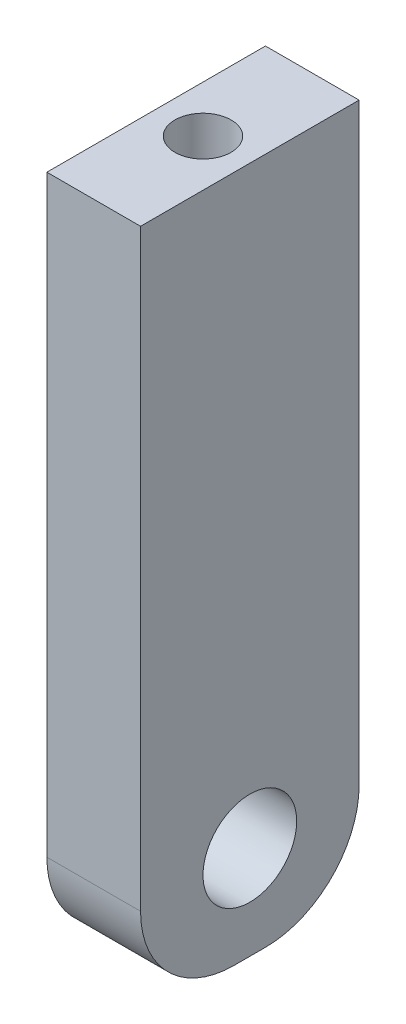
ISO-10303-21;
HEADER;
FILE_DESCRIPTION(('STEP AP214'),'2;1');
FILE_NAME('part.step','',(''),(''),'','','');
FILE_SCHEMA(('AUTOMOTIVE_DESIGN { 1 0 10303 214 1 1 1 1 }'));
ENDSEC;
DATA;
#1=APPLICATION_CONTEXT('core data for automotive mechanical design processes');
#2=APPLICATION_PROTOCOL_DEFINITION('international standard','automotive_design',2000,#1);
#3=PRODUCT_CONTEXT('',#1,'mechanical');
#4=PRODUCT('Part','Part','',(#3));
#5=PRODUCT_RELATED_PRODUCT_CATEGORY('part','',(#4));
#6=PRODUCT_DEFINITION_FORMATION('','',#4);
#7=PRODUCT_DEFINITION_CONTEXT('part definition',#1,'design');
#8=PRODUCT_DEFINITION('design','',#6,#7);
#9=PRODUCT_DEFINITION_SHAPE('','',#8);
#10=(LENGTH_UNIT() NAMED_UNIT(*) SI_UNIT(.MILLI.,.METRE.));
#11=(NAMED_UNIT(*) PLANE_ANGLE_UNIT() SI_UNIT($,.RADIAN.));
#12=(NAMED_UNIT(*) SI_UNIT($,.STERADIAN.) SOLID_ANGLE_UNIT());
#13=UNCERTAINTY_MEASURE_WITH_UNIT(LENGTH_MEASURE(1.E-05),#10,'distance_accuracy_value','');
#14=(GEOMETRIC_REPRESENTATION_CONTEXT(3) GLOBAL_UNCERTAINTY_ASSIGNED_CONTEXT((#13)) GLOBAL_UNIT_ASSIGNED_CONTEXT((#10,
#11,#12)) REPRESENTATION_CONTEXT('',''));
#15=CARTESIAN_POINT('',(0.,0.,0.));
#16=DIRECTION('',(0.,0.,1.));
#17=DIRECTION('',(1.,0.,0.));
#18=AXIS2_PLACEMENT_3D('',#15,#16,#17);
#19=CARTESIAN_POINT('',(3.,0.546254549383258,7.));
#20=DIRECTION('',(0.,-1.,0.));
#21=DIRECTION('',(1.,0.,0.));
#22=AXIS2_PLACEMENT_3D('',#19,#20,#21);
#23=PLANE('',#22);
#24=CARTESIAN_POINT('',(1.5,0.546254549383257,3.5));
#25=DIRECTION('',(0.,1.,0.));
#26=DIRECTION('',(-1.,0.,0.));
#27=AXIS2_PLACEMENT_3D('',#24,#25,#26);
#28=CIRCLE('',#27,0.9);
#29=CARTESIAN_POINT('',(0.6,0.546254549383257,3.5));
#30=VERTEX_POINT('',#29);
#31=EDGE_CURVE('E193',#30,#30,#28,.T.);
#32=ORIENTED_EDGE('',*,*,#31,.F.);
#33=EDGE_LOOP('',(#32));
#34=FACE_BOUND('',#33,.T.);
#35=DIRECTION('',(-1.,0.,0.));
#36=VECTOR('',#35,1.);
#37=CARTESIAN_POINT('',(3.,0.546254549383258,0.));
#38=LINE('',#37,#36);
#39=CARTESIAN_POINT('',(3.,0.546254549383258,0.));
#40=VERTEX_POINT('',#39);
#41=CARTESIAN_POINT('',(0.,0.546254549383257,0.));
#42=VERTEX_POINT('',#41);
#43=EDGE_CURVE('E115',#40,#42,#38,.T.);
#44=ORIENTED_EDGE('',*,*,#43,.T.);
#45=DIRECTION('',(0.,0.,-1.));
#46=VECTOR('',#45,1.);
#47=CARTESIAN_POINT('',(0.,0.546254549383257,7.));
#48=LINE('',#47,#46);
#49=CARTESIAN_POINT('',(0.,0.546254549383257,7.));
#50=VERTEX_POINT('',#49);
#51=EDGE_CURVE('E97',#50,#42,#48,.T.);
#52=ORIENTED_EDGE('',*,*,#51,.F.);
#53=DIRECTION('',(-1.,0.,0.));
#54=VECTOR('',#53,1.);
#55=CARTESIAN_POINT('',(3.,0.546254549383258,7.));
#56=LINE('',#55,#54);
#57=CARTESIAN_POINT('',(3.,0.546254549383258,7.));
#58=VERTEX_POINT('',#57);
#59=EDGE_CURVE('E104',#58,#50,#56,.T.);
#60=ORIENTED_EDGE('',*,*,#59,.F.);
#61=DIRECTION('',(0.,0.,-1.));
#62=VECTOR('',#61,1.);
#63=CARTESIAN_POINT('',(3.,0.546254549383258,7.));
#64=LINE('',#63,#62);
#65=EDGE_CURVE('E143',#58,#40,#64,.T.);
#66=ORIENTED_EDGE('',*,*,#65,.T.);
#67=EDGE_LOOP('',(#44,#52,#60,#66));
#68=FACE_BOUND('',#67,.T.);
#69=ADVANCED_FACE('F41',(#34,#68),#23,.F.);
#70=CARTESIAN_POINT('',(0.,0.546254549383257,7.));
#71=DIRECTION('',(1.,0.,0.));
#72=DIRECTION('',(0.,1.,0.));
#73=AXIS2_PLACEMENT_3D('',#70,#71,#72);
#74=PLANE('',#73);
#75=CARTESIAN_POINT('',(0.,-18.4537454506167,3.5));
#76=DIRECTION('',(1.,0.,0.));
#77=DIRECTION('',(0.,0.,-1.));
#78=AXIS2_PLACEMENT_3D('',#75,#76,#77);
#79=CIRCLE('',#78,1.5);
#80=CARTESIAN_POINT('',(0.,-18.4537454506167,2.));
#81=VERTEX_POINT('',#80);
#82=EDGE_CURVE('E149',#81,#81,#79,.T.);
#83=ORIENTED_EDGE('',*,*,#82,.T.);
#84=EDGE_LOOP('',(#83));
#85=FACE_BOUND('',#84,.T.);
#86=DIRECTION('',(0.,0.,-1.));
#87=VECTOR('',#86,1.);
#88=CARTESIAN_POINT('',(0.,-21.4537454506167,7.));
#89=LINE('',#88,#87);
#90=CARTESIAN_POINT('',(0.,-21.4537454506167,4.));
#91=VERTEX_POINT('',#90);
#92=CARTESIAN_POINT('',(0.,-21.4537454506167,3.));
#93=VERTEX_POINT('',#92);
#94=EDGE_CURVE('E117',#91,#93,#89,.T.);
#95=ORIENTED_EDGE('',*,*,#94,.F.);
#96=CARTESIAN_POINT('',(0.,-18.4537454506167,4.));
#97=DIRECTION('',(1.,0.,0.));
#98=DIRECTION('',(0.,1.,0.));
#99=AXIS2_PLACEMENT_3D('',#96,#97,#98);
#100=CIRCLE('',#99,3.);
#101=CARTESIAN_POINT('',(0.,-18.4537454506167,7.));
#102=VERTEX_POINT('',#101);
#103=EDGE_CURVE('E49',#91,#102,#100,.F.);
#104=ORIENTED_EDGE('',*,*,#103,.T.);
#105=DIRECTION('',(0.,-1.,0.));
#106=VECTOR('',#105,1.);
#107=CARTESIAN_POINT('',(0.,0.546254549383257,7.));
#108=LINE('',#107,#106);
#109=EDGE_CURVE('E93',#50,#102,#108,.T.);
#110=ORIENTED_EDGE('',*,*,#109,.F.);
#111=ORIENTED_EDGE('',*,*,#51,.T.);
#112=DIRECTION('',(0.,-1.,0.));
#113=VECTOR('',#112,1.);
#114=CARTESIAN_POINT('',(0.,0.546254549383257,0.));
#115=LINE('',#114,#113);
#116=CARTESIAN_POINT('',(0.,-18.4537454506167,0.));
#117=VERTEX_POINT('',#116);
#118=EDGE_CURVE('E148',#42,#117,#115,.T.);
#119=ORIENTED_EDGE('',*,*,#118,.T.);
#120=CARTESIAN_POINT('',(0.,-18.4537454506167,3.));
#121=DIRECTION('',(1.,0.,0.));
#122=DIRECTION('',(0.,1.,0.));
#123=AXIS2_PLACEMENT_3D('',#120,#121,#122);
#124=CIRCLE('',#123,3.);
#125=EDGE_CURVE('E61',#117,#93,#124,.F.);
#126=ORIENTED_EDGE('',*,*,#125,.T.);
#127=EDGE_LOOP('',(#95,#104,#110,#111,#119,#126));
#128=FACE_BOUND('',#127,.T.);
#129=ADVANCED_FACE('F95',(#85,#128),#74,.F.);
#130=CARTESIAN_POINT('',(0.,-21.4537454506167,7.));
#131=DIRECTION('',(0.,1.,0.));
#132=DIRECTION('',(0.,0.,1.));
#133=AXIS2_PLACEMENT_3D('',#130,#131,#132);
#134=PLANE('',#133);
#135=DIRECTION('',(0.,0.,-1.));
#136=VECTOR('',#135,1.);
#137=CARTESIAN_POINT('',(3.,-21.4537454506167,7.));
#138=LINE('',#137,#136);
#139=CARTESIAN_POINT('',(3.,-21.4537454506167,4.));
#140=VERTEX_POINT('',#139);
#141=CARTESIAN_POINT('',(3.,-21.4537454506167,3.));
#142=VERTEX_POINT('',#141);
#143=EDGE_CURVE('E121',#140,#142,#138,.T.);
#144=ORIENTED_EDGE('',*,*,#143,.F.);
#145=DIRECTION('',(1.,0.,0.));
#146=VECTOR('',#145,1.);
#147=CARTESIAN_POINT('',(0.,-21.4537454506167,4.));
#148=LINE('',#147,#146);
#149=EDGE_CURVE('E131',#140,#91,#148,.F.);
#150=ORIENTED_EDGE('',*,*,#149,.T.);
#151=ORIENTED_EDGE('',*,*,#94,.T.);
#152=DIRECTION('',(1.,0.,0.));
#153=VECTOR('',#152,1.);
#154=CARTESIAN_POINT('',(0.,-21.4537454506167,3.));
#155=LINE('',#154,#153);
#156=EDGE_CURVE('E128',#93,#142,#155,.T.);
#157=ORIENTED_EDGE('',*,*,#156,.T.);
#158=EDGE_LOOP('',(#144,#150,#151,#157));
#159=FACE_BOUND('',#158,.T.);
#160=ADVANCED_FACE('F136',(#159),#134,.F.);
#161=CARTESIAN_POINT('',(3.,-21.4537454506167,7.));
#162=DIRECTION('',(-1.,0.,0.));
#163=DIRECTION('',(0.,0.,1.));
#164=AXIS2_PLACEMENT_3D('',#161,#162,#163);
#165=PLANE('',#164);
#166=CARTESIAN_POINT('',(3.,-18.4537454506167,3.5));
#167=DIRECTION('',(1.,0.,0.));
#168=DIRECTION('',(0.,0.,-1.));
#169=AXIS2_PLACEMENT_3D('',#166,#167,#168);
#170=CIRCLE('',#169,1.5);
#171=CARTESIAN_POINT('',(3.,-18.4537454506167,2.));
#172=VERTEX_POINT('',#171);
#173=EDGE_CURVE('E192',#172,#172,#170,.T.);
#174=ORIENTED_EDGE('',*,*,#173,.F.);
#175=EDGE_LOOP('',(#174));
#176=FACE_BOUND('',#175,.T.);
#177=DIRECTION('',(0.,1.,0.));
#178=VECTOR('',#177,1.);
#179=CARTESIAN_POINT('',(3.,-21.4537454506167,7.));
#180=LINE('',#179,#178);
#181=CARTESIAN_POINT('',(3.,-18.4537454506167,7.));
#182=VERTEX_POINT('',#181);
#183=EDGE_CURVE('E103',#182,#58,#180,.T.);
#184=ORIENTED_EDGE('',*,*,#183,.F.);
#185=CARTESIAN_POINT('',(3.,-18.4537454506167,4.));
#186=DIRECTION('',(-1.,0.,0.));
#187=DIRECTION('',(0.,0.,1.));
#188=AXIS2_PLACEMENT_3D('',#185,#186,#187);
#189=CIRCLE('',#188,3.);
#190=EDGE_CURVE('E126',#182,#140,#189,.F.);
#191=ORIENTED_EDGE('',*,*,#190,.T.);
#192=ORIENTED_EDGE('',*,*,#143,.T.);
#193=CARTESIAN_POINT('',(3.,-18.4537454506167,3.));
#194=DIRECTION('',(-1.,0.,0.));
#195=DIRECTION('',(0.,0.,1.));
#196=AXIS2_PLACEMENT_3D('',#193,#194,#195);
#197=CIRCLE('',#196,3.);
#198=CARTESIAN_POINT('',(3.,-18.4537454506167,0.));
#199=VERTEX_POINT('',#198);
#200=EDGE_CURVE('E119',#142,#199,#197,.F.);
#201=ORIENTED_EDGE('',*,*,#200,.T.);
#202=DIRECTION('',(0.,1.,0.));
#203=VECTOR('',#202,1.);
#204=CARTESIAN_POINT('',(3.,-21.4537454506167,0.));
#205=LINE('',#204,#203);
#206=EDGE_CURVE('E112',#199,#40,#205,.T.);
#207=ORIENTED_EDGE('',*,*,#206,.T.);
#208=ORIENTED_EDGE('',*,*,#65,.F.);
#209=EDGE_LOOP('',(#184,#191,#192,#201,#207,#208));
#210=FACE_BOUND('',#209,.T.);
#211=ADVANCED_FACE('F142',(#176,#210),#165,.F.);
#212=CARTESIAN_POINT('',(0.,0.,7.));
#213=DIRECTION('',(0.,0.,1.));
#214=DIRECTION('',(1.,0.,0.));
#215=AXIS2_PLACEMENT_3D('',#212,#213,#214);
#216=PLANE('',#215);
#217=ORIENTED_EDGE('',*,*,#109,.T.);
#218=DIRECTION('',(1.,0.,0.));
#219=VECTOR('',#218,1.);
#220=CARTESIAN_POINT('',(3.,-18.4537454506167,7.));
#221=LINE('',#220,#219);
#222=EDGE_CURVE('E116',#102,#182,#221,.T.);
#223=ORIENTED_EDGE('',*,*,#222,.T.);
#224=ORIENTED_EDGE('',*,*,#183,.T.);
#225=ORIENTED_EDGE('',*,*,#59,.T.);
#226=EDGE_LOOP('',(#217,#223,#224,#225));
#227=FACE_BOUND('',#226,.T.);
#228=ADVANCED_FACE('F107',(#227),#216,.T.);
#229=CARTESIAN_POINT('',(0.,0.,0.));
#230=DIRECTION('',(0.,0.,1.));
#231=DIRECTION('',(1.,0.,0.));
#232=AXIS2_PLACEMENT_3D('',#229,#230,#231);
#233=PLANE('',#232);
#234=ORIENTED_EDGE('',*,*,#206,.F.);
#235=DIRECTION('',(1.,0.,0.));
#236=VECTOR('',#235,1.);
#237=CARTESIAN_POINT('',(0.,-18.4537454506167,0.));
#238=LINE('',#237,#236);
#239=EDGE_CURVE('E11',#199,#117,#238,.F.);
#240=ORIENTED_EDGE('',*,*,#239,.T.);
#241=ORIENTED_EDGE('',*,*,#118,.F.);
#242=ORIENTED_EDGE('',*,*,#43,.F.);
#243=EDGE_LOOP('',(#234,#240,#241,#242));
#244=FACE_BOUND('',#243,.T.);
#245=ADVANCED_FACE('F152',(#244),#233,.F.);
#246=CARTESIAN_POINT('',(0.,-18.4537454506167,3.5));
#247=DIRECTION('',(1.,0.,0.));
#248=DIRECTION('',(0.,0.,-1.));
#249=AXIS2_PLACEMENT_3D('',#246,#247,#248);
#250=CYLINDRICAL_SURFACE('',#249,1.5);
#251=CARTESIAN_POINT('',(0.,-18.4537454506167,2.));
#252=CARTESIAN_POINT('',(0.0312499999999995,-18.4537454506167,2.));
#253=CARTESIAN_POINT('',(0.0624999999999996,-18.4537454506167,2.));
#254=CARTESIAN_POINT('',(0.125,-18.4537454506167,2.));
#255=CARTESIAN_POINT('',(0.15625,-18.4537454506167,2.));
#256=CARTESIAN_POINT('',(0.21875,-18.4537454506167,2.));
#257=CARTESIAN_POINT('',(0.25,-18.4537454506167,2.));
#258=CARTESIAN_POINT('',(0.3125,-18.4537454506167,2.));
#259=CARTESIAN_POINT('',(0.34375,-18.4537454506167,2.));
#260=CARTESIAN_POINT('',(0.40625,-18.4537454506167,2.));
#261=CARTESIAN_POINT('',(0.4375,-18.4537454506167,2.));
#262=CARTESIAN_POINT('',(0.5,-18.4537454506167,2.));
#263=CARTESIAN_POINT('',(0.53125,-18.4537454506167,2.));
#264=CARTESIAN_POINT('',(0.59375,-18.4537454506167,2.));
#265=CARTESIAN_POINT('',(0.625,-18.4537454506167,2.));
#266=CARTESIAN_POINT('',(0.6875,-18.4537454506167,2.));
#267=CARTESIAN_POINT('',(0.71875,-18.4537454506167,2.));
#268=CARTESIAN_POINT('',(0.78125,-18.4537454506167,2.));
#269=CARTESIAN_POINT('',(0.8125,-18.4537454506167,2.));
#270=CARTESIAN_POINT('',(0.875,-18.4537454506167,2.));
#271=CARTESIAN_POINT('',(0.90625,-18.4537454506167,2.));
#272=CARTESIAN_POINT('',(0.96875,-18.4537454506167,2.));
#273=CARTESIAN_POINT('',(1.,-18.4537454506167,2.));
#274=CARTESIAN_POINT('',(1.0625,-18.4537454506167,2.));
#275=CARTESIAN_POINT('',(1.09375,-18.4537454506167,2.));
#276=CARTESIAN_POINT('',(1.15625,-18.4537454506167,2.));
#277=CARTESIAN_POINT('',(1.1875,-18.4537454506167,2.));
#278=CARTESIAN_POINT('',(1.25,-18.4537454506167,2.));
#279=CARTESIAN_POINT('',(1.28125,-18.4537454506167,2.));
#280=CARTESIAN_POINT('',(1.34375,-18.4537454506167,2.));
#281=CARTESIAN_POINT('',(1.375,-18.4537454506167,2.));
#282=CARTESIAN_POINT('',(1.4375,-18.4537454506167,2.));
#283=CARTESIAN_POINT('',(1.46875,-18.4537454506167,2.));
#284=CARTESIAN_POINT('',(1.53125,-18.4537454506167,2.));
#285=CARTESIAN_POINT('',(1.5625,-18.4537454506167,2.));
#286=CARTESIAN_POINT('',(1.625,-18.4537454506167,2.));
#287=CARTESIAN_POINT('',(1.65625,-18.4537454506167,2.));
#288=CARTESIAN_POINT('',(1.71875,-18.4537454506167,2.));
#289=CARTESIAN_POINT('',(1.75,-18.4537454506167,2.));
#290=CARTESIAN_POINT('',(1.8125,-18.4537454506167,2.));
#291=CARTESIAN_POINT('',(1.84375,-18.4537454506167,2.));
#292=CARTESIAN_POINT('',(1.90625,-18.4537454506167,2.));
#293=CARTESIAN_POINT('',(1.9375,-18.4537454506167,2.));
#294=CARTESIAN_POINT('',(2.,-18.4537454506167,2.));
#295=CARTESIAN_POINT('',(2.03125,-18.4537454506167,2.));
#296=CARTESIAN_POINT('',(2.09375,-18.4537454506167,2.));
#297=CARTESIAN_POINT('',(2.125,-18.4537454506167,2.));
#298=CARTESIAN_POINT('',(2.1875,-18.4537454506167,2.));
#299=CARTESIAN_POINT('',(2.21875,-18.4537454506167,2.));
#300=CARTESIAN_POINT('',(2.28125,-18.4537454506167,2.));
#301=CARTESIAN_POINT('',(2.3125,-18.4537454506167,2.));
#302=CARTESIAN_POINT('',(2.375,-18.4537454506167,2.));
#303=CARTESIAN_POINT('',(2.40625,-18.4537454506167,2.));
#304=CARTESIAN_POINT('',(2.46875,-18.4537454506167,2.));
#305=CARTESIAN_POINT('',(2.5,-18.4537454506167,2.));
#306=CARTESIAN_POINT('',(2.5625,-18.4537454506167,2.));
#307=CARTESIAN_POINT('',(2.59375,-18.4537454506167,2.));
#308=CARTESIAN_POINT('',(2.65625,-18.4537454506167,2.));
#309=CARTESIAN_POINT('',(2.6875,-18.4537454506167,2.));
#310=CARTESIAN_POINT('',(2.75,-18.4537454506167,2.));
#311=CARTESIAN_POINT('',(2.78125,-18.4537454506167,2.));
#312=CARTESIAN_POINT('',(2.84375,-18.4537454506167,2.));
#313=CARTESIAN_POINT('',(2.875,-18.4537454506167,2.));
#314=CARTESIAN_POINT('',(2.9375,-18.4537454506167,2.));
#315=CARTESIAN_POINT('',(2.96875,-18.4537454506167,2.));
#316=CARTESIAN_POINT('',(3.,-18.4537454506167,2.));
#317=B_SPLINE_CURVE_WITH_KNOTS('',3,(#251,#252,#253,#254,#255,#256,#257,#258,#259,#260,#261,
#262,#263,#264,#265,#266,#267,#268,#269,#270,#271,#272,#273,#274,#275,#276,#277,#278,#279,#280,
#281,#282,#283,#284,#285,#286,#287,#288,#289,#290,#291,#292,#293,#294,#295,#296,#297,#298,#299,
#300,#301,#302,#303,#304,#305,#306,#307,#308,#309,#310,#311,#312,#313,#314,#315,#316),
.UNSPECIFIED.,.F.,.F.,(4,2,2,2,2,2,2,2,2,2,2,2,2,2,2,2,2,2,2,2,2,2,2,2,2,2,2,2,2,2,2,2,4),(0.,
0.09375,0.1875,0.28125,0.375,0.46875,0.5625,0.65625,0.75,0.84375,0.9375,1.03125,1.125,1.21875,
1.3125,1.40625,1.5,1.59375,1.6875,1.78125,1.875,1.96875,2.0625,2.15625,2.25,2.34375,2.4375,
2.53125,2.625,2.71875,2.8125,2.90625,3.),.UNSPECIFIED.);
#318=EDGE_CURVE('BSEAM163',#81,#172,#317,.T.);
#319=ORIENTED_EDGE('',*,*,#82,.F.);
#320=ORIENTED_EDGE('',*,*,#173,.T.);
#321=ORIENTED_EDGE('',*,*,#318,.T.);
#322=ORIENTED_EDGE('',*,*,#318,.F.);
#323=EDGE_LOOP('',(#319,#321,#320,#322));
#324=FACE_BOUND('',#323,.T.);
#325=ADVANCED_FACE('F163',(#324),#250,.F.);
#326=CARTESIAN_POINT('',(0.,-18.4537454506167,4.));
#327=DIRECTION('',(-1.,0.,0.));
#328=DIRECTION('',(0.,0.,1.));
#329=AXIS2_PLACEMENT_3D('',#326,#327,#328);
#330=CYLINDRICAL_SURFACE('',#329,3.);
#331=ORIENTED_EDGE('',*,*,#103,.F.);
#332=ORIENTED_EDGE('',*,*,#149,.F.);
#333=ORIENTED_EDGE('',*,*,#190,.F.);
#334=ORIENTED_EDGE('',*,*,#222,.F.);
#335=EDGE_LOOP('',(#331,#332,#333,#334));
#336=FACE_BOUND('',#335,.T.);
#337=ADVANCED_FACE('F140',(#336),#330,.T.);
#338=CARTESIAN_POINT('',(0.,-18.4537454506167,3.));
#339=DIRECTION('',(1.,0.,0.));
#340=DIRECTION('',(0.,0.,-1.));
#341=AXIS2_PLACEMENT_3D('',#338,#339,#340);
#342=CYLINDRICAL_SURFACE('',#341,3.);
#343=ORIENTED_EDGE('',*,*,#125,.F.);
#344=ORIENTED_EDGE('',*,*,#239,.F.);
#345=ORIENTED_EDGE('',*,*,#200,.F.);
#346=ORIENTED_EDGE('',*,*,#156,.F.);
#347=EDGE_LOOP('',(#343,#344,#345,#346));
#348=FACE_BOUND('',#347,.T.);
#349=ADVANCED_FACE('F43',(#348),#342,.T.);
#350=CARTESIAN_POINT('',(1.5,-6.45374545061674,3.5));
#351=DIRECTION('',(0.,1.,0.));
#352=DIRECTION('',(-1.,0.,0.));
#353=AXIS2_PLACEMENT_3D('',#350,#351,#352);
#354=CYLINDRICAL_SURFACE('',#353,0.9);
#355=CARTESIAN_POINT('',(1.5,-6.45374545061674,3.5));
#356=DIRECTION('',(0.,1.,0.));
#357=DIRECTION('',(-1.,0.,0.));
#358=AXIS2_PLACEMENT_3D('',#355,#356,#357);
#359=CIRCLE('',#358,0.9);
#360=CARTESIAN_POINT('',(0.600000000000001,-6.45374545061674,3.5));
#361=VERTEX_POINT('',#360);
#362=EDGE_CURVE('E191',#361,#361,#359,.T.);
#363=ORIENTED_EDGE('',*,*,#362,.F.);
#364=EDGE_LOOP('',(#363));
#365=FACE_BOUND('',#364,.T.);
#366=ORIENTED_EDGE('',*,*,#31,.T.);
#367=EDGE_LOOP('',(#366));
#368=FACE_BOUND('',#367,.T.);
#369=ADVANCED_FACE('F154',(#365,#368),#354,.F.);
#370=CARTESIAN_POINT('',(1.5,-6.45374545061674,3.5));
#371=DIRECTION('',(0.,1.,0.));
#372=DIRECTION('',(-1.,0.,0.));
#373=AXIS2_PLACEMENT_3D('',#370,#371,#372);
#374=PLANE('',#373);
#375=ORIENTED_EDGE('',*,*,#362,.T.);
#376=EDGE_LOOP('',(#375));
#377=FACE_BOUND('',#376,.T.);
#378=ADVANCED_FACE('F160',(#377),#374,.T.);
#379=CLOSED_SHELL('',(#69,#129,#160,#211,#228,#245,#325,#337,#349,#369,#378));
#380=MANIFOLD_SOLID_BREP('B2',#379);
#381=ADVANCED_BREP_SHAPE_REPRESENTATION('',(#18,#380),#14);
#382=SHAPE_DEFINITION_REPRESENTATION(#9,#381);
ENDSEC;
END-ISO-10303-21;
